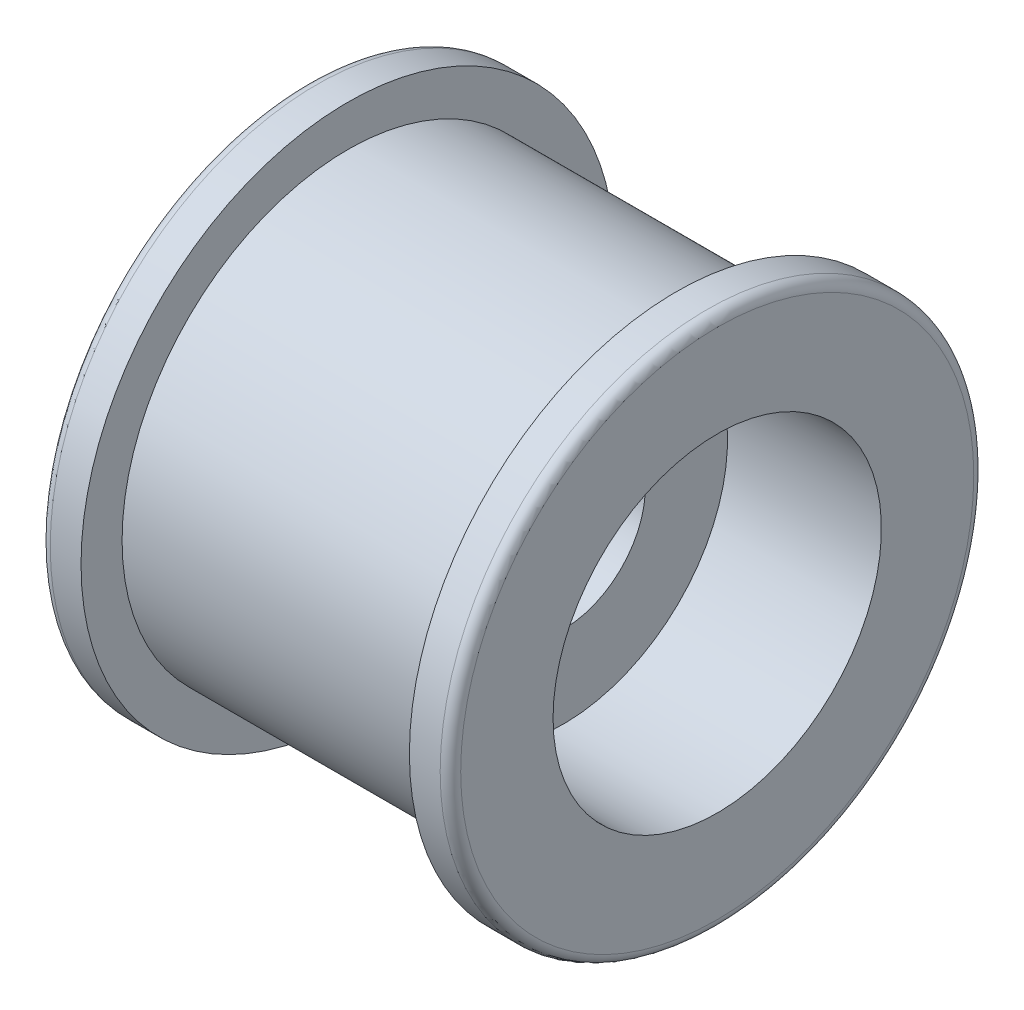
ISO-10303-21;
HEADER;
FILE_DESCRIPTION(('STEP AP214'),'2;1');
FILE_NAME('part.step','',(''),(''),'','','');
FILE_SCHEMA(('AUTOMOTIVE_DESIGN { 1 0 10303 214 1 1 1 1 }'));
ENDSEC;
DATA;
#1=APPLICATION_CONTEXT('core data for automotive mechanical design processes');
#2=APPLICATION_PROTOCOL_DEFINITION('international standard','automotive_design',2000,#1);
#3=PRODUCT_CONTEXT('',#1,'mechanical');
#4=PRODUCT('Part','Part','',(#3));
#5=PRODUCT_RELATED_PRODUCT_CATEGORY('part','',(#4));
#6=PRODUCT_DEFINITION_FORMATION('','',#4);
#7=PRODUCT_DEFINITION_CONTEXT('part definition',#1,'design');
#8=PRODUCT_DEFINITION('design','',#6,#7);
#9=PRODUCT_DEFINITION_SHAPE('','',#8);
#10=(LENGTH_UNIT() NAMED_UNIT(*) SI_UNIT(.MILLI.,.METRE.));
#11=(NAMED_UNIT(*) PLANE_ANGLE_UNIT() SI_UNIT($,.RADIAN.));
#12=(NAMED_UNIT(*) SI_UNIT($,.STERADIAN.) SOLID_ANGLE_UNIT());
#13=UNCERTAINTY_MEASURE_WITH_UNIT(LENGTH_MEASURE(1.E-05),#10,'distance_accuracy_value','');
#14=(GEOMETRIC_REPRESENTATION_CONTEXT(3) GLOBAL_UNCERTAINTY_ASSIGNED_CONTEXT((#13)) GLOBAL_UNIT_ASSIGNED_CONTEXT((#10,
#11,#12)) REPRESENTATION_CONTEXT('',''));
#15=CARTESIAN_POINT('',(0.,0.,0.));
#16=DIRECTION('',(0.,0.,1.));
#17=DIRECTION('',(1.,0.,0.));
#18=AXIS2_PLACEMENT_3D('',#15,#16,#17);
#19=CARTESIAN_POINT('',(17.9695550771957,6.99999999999999,0.));
#20=DIRECTION('',(1.,0.,0.));
#21=DIRECTION('',(0.,0.,-1.));
#22=AXIS2_PLACEMENT_3D('',#19,#20,#21);
#23=PLANE('',#22);
#24=CARTESIAN_POINT('',(17.9695550771957,-4.,0.));
#25=DIRECTION('',(-1.,0.,0.));
#26=DIRECTION('',(0.,0.,1.));
#27=AXIS2_PLACEMENT_3D('',#24,#25,#26);
#28=CIRCLE('',#27,11.);
#29=CARTESIAN_POINT('',(17.9695550771957,-4.,11.));
#30=VERTEX_POINT('',#29);
#31=EDGE_CURVE('E51',#30,#30,#28,.T.);
#32=ORIENTED_EDGE('',*,*,#31,.F.);
#33=EDGE_LOOP('',(#32));
#34=FACE_BOUND('',#33,.T.);
#35=CARTESIAN_POINT('',(17.9695550771957,-4.,0.));
#36=DIRECTION('',(-1.,0.,0.));
#37=DIRECTION('',(0.,0.,1.));
#38=AXIS2_PLACEMENT_3D('',#35,#36,#37);
#39=CIRCLE('',#38,13.);
#40=CARTESIAN_POINT('',(17.9695550771957,-4.,13.));
#41=VERTEX_POINT('',#40);
#42=EDGE_CURVE('E78',#41,#41,#39,.T.);
#43=ORIENTED_EDGE('',*,*,#42,.T.);
#44=EDGE_LOOP('',(#43));
#45=FACE_BOUND('',#44,.T.);
#46=ADVANCED_FACE('F31',(#34,#45),#23,.F.);
#47=CARTESIAN_POINT('',(-15.2512241435836,-4.,0.));
#48=DIRECTION('',(-1.,0.,0.));
#49=DIRECTION('',(0.,0.,1.));
#50=AXIS2_PLACEMENT_3D('',#47,#48,#49);
#51=CYLINDRICAL_SURFACE('',#50,11.);
#52=CARTESIAN_POINT('',(1.96955507719565,-4.,0.));
#53=DIRECTION('',(-1.,0.,0.));
#54=DIRECTION('',(0.,0.,1.));
#55=AXIS2_PLACEMENT_3D('',#52,#53,#54);
#56=CIRCLE('',#55,11.);
#57=CARTESIAN_POINT('',(1.96955507719565,-4.,11.));
#58=VERTEX_POINT('',#57);
#59=EDGE_CURVE('E54',#58,#58,#56,.T.);
#60=ORIENTED_EDGE('',*,*,#59,.F.);
#61=EDGE_LOOP('',(#60));
#62=FACE_BOUND('',#61,.T.);
#63=ORIENTED_EDGE('',*,*,#31,.T.);
#64=EDGE_LOOP('',(#63));
#65=FACE_BOUND('',#64,.T.);
#66=ADVANCED_FACE('F96',(#62,#65),#51,.T.);
#67=CARTESIAN_POINT('',(1.96955507719565,7.,0.));
#68=DIRECTION('',(-1.,0.,0.));
#69=DIRECTION('',(0.,0.,1.));
#70=AXIS2_PLACEMENT_3D('',#67,#68,#69);
#71=PLANE('',#70);
#72=CARTESIAN_POINT('',(1.96955507719565,-4.,0.));
#73=DIRECTION('',(-1.,0.,0.));
#74=DIRECTION('',(0.,0.,1.));
#75=AXIS2_PLACEMENT_3D('',#72,#73,#74);
#76=CIRCLE('',#75,13.);
#77=CARTESIAN_POINT('',(1.96955507719565,-4.,13.));
#78=VERTEX_POINT('',#77);
#79=EDGE_CURVE('E57',#78,#78,#76,.T.);
#80=ORIENTED_EDGE('',*,*,#79,.F.);
#81=EDGE_LOOP('',(#80));
#82=FACE_BOUND('',#81,.T.);
#83=ORIENTED_EDGE('',*,*,#59,.T.);
#84=EDGE_LOOP('',(#83));
#85=FACE_BOUND('',#84,.T.);
#86=ADVANCED_FACE('F102',(#82,#85),#71,.F.);
#87=CARTESIAN_POINT('',(-15.2512241435836,-4.,0.));
#88=DIRECTION('',(-1.,0.,0.));
#89=DIRECTION('',(0.,0.,1.));
#90=AXIS2_PLACEMENT_3D('',#87,#88,#89);
#91=CYLINDRICAL_SURFACE('',#90,13.);
#92=CARTESIAN_POINT('',(0.469555077195653,-4.,0.));
#93=DIRECTION('',(1.,0.,0.));
#94=DIRECTION('',(0.,0.,-1.));
#95=AXIS2_PLACEMENT_3D('',#92,#93,#94);
#96=CIRCLE('',#95,13.);
#97=CARTESIAN_POINT('',(0.469555077195653,-4.,-13.));
#98=VERTEX_POINT('',#97);
#99=EDGE_CURVE('E42',#98,#98,#96,.T.);
#100=ORIENTED_EDGE('',*,*,#99,.T.);
#101=EDGE_LOOP('',(#100));
#102=FACE_BOUND('',#101,.T.);
#103=ORIENTED_EDGE('',*,*,#79,.T.);
#104=EDGE_LOOP('',(#103));
#105=FACE_BOUND('',#104,.T.);
#106=ADVANCED_FACE('F109',(#102,#105),#91,.T.);
#107=CARTESIAN_POINT('',(-0.030444922804349,7.,0.));
#108=DIRECTION('',(1.,0.,0.));
#109=DIRECTION('',(0.,0.,-1.));
#110=AXIS2_PLACEMENT_3D('',#107,#108,#109);
#111=PLANE('',#110);
#112=CARTESIAN_POINT('',(-0.030444922804349,-4.,0.));
#113=DIRECTION('',(1.,0.,0.));
#114=DIRECTION('',(0.,0.,-1.));
#115=AXIS2_PLACEMENT_3D('',#112,#113,#114);
#116=CIRCLE('',#115,12.5);
#117=CARTESIAN_POINT('',(-0.030444922804349,-4.,-12.5));
#118=VERTEX_POINT('',#117);
#119=EDGE_CURVE('E46',#118,#118,#116,.F.);
#120=ORIENTED_EDGE('',*,*,#119,.T.);
#121=EDGE_LOOP('',(#120));
#122=FACE_BOUND('',#121,.T.);
#123=CARTESIAN_POINT('',(-0.0304449228043496,-4.,0.));
#124=DIRECTION('',(-1.,0.,0.));
#125=DIRECTION('',(0.,0.,1.));
#126=AXIS2_PLACEMENT_3D('',#123,#124,#125);
#127=CIRCLE('',#126,8.);
#128=CARTESIAN_POINT('',(-0.0304449228043496,-4.,8.));
#129=VERTEX_POINT('',#128);
#130=EDGE_CURVE('E60',#129,#129,#127,.T.);
#131=ORIENTED_EDGE('',*,*,#130,.F.);
#132=EDGE_LOOP('',(#131));
#133=FACE_BOUND('',#132,.T.);
#134=ADVANCED_FACE('F113',(#122,#133),#111,.F.);
#135=CARTESIAN_POINT('',(-15.2512241435836,-4.,0.));
#136=DIRECTION('',(-1.,0.,0.));
#137=DIRECTION('',(0.,0.,1.));
#138=AXIS2_PLACEMENT_3D('',#135,#136,#137);
#139=CYLINDRICAL_SURFACE('',#138,8.);
#140=CARTESIAN_POINT('',(7.46955507719565,-4.,0.));
#141=DIRECTION('',(-1.,0.,0.));
#142=DIRECTION('',(0.,0.,1.));
#143=AXIS2_PLACEMENT_3D('',#140,#141,#142);
#144=CIRCLE('',#143,8.);
#145=CARTESIAN_POINT('',(7.46955507719565,-4.,8.));
#146=VERTEX_POINT('',#145);
#147=EDGE_CURVE('E63',#146,#146,#144,.T.);
#148=ORIENTED_EDGE('',*,*,#147,.F.);
#149=EDGE_LOOP('',(#148));
#150=FACE_BOUND('',#149,.T.);
#151=ORIENTED_EDGE('',*,*,#130,.T.);
#152=EDGE_LOOP('',(#151));
#153=FACE_BOUND('',#152,.T.);
#154=ADVANCED_FACE('F117',(#150,#153),#139,.F.);
#155=CARTESIAN_POINT('',(7.46955507719565,4.,0.));
#156=DIRECTION('',(1.,0.,0.));
#157=DIRECTION('',(0.,0.,-1.));
#158=AXIS2_PLACEMENT_3D('',#155,#156,#157);
#159=PLANE('',#158);
#160=CARTESIAN_POINT('',(7.46955507719565,-4.,0.));
#161=DIRECTION('',(-1.,0.,0.));
#162=DIRECTION('',(0.,0.,1.));
#163=AXIS2_PLACEMENT_3D('',#160,#161,#162);
#164=CIRCLE('',#163,4.);
#165=CARTESIAN_POINT('',(7.46955507719565,-4.,4.));
#166=VERTEX_POINT('',#165);
#167=EDGE_CURVE('E66',#166,#166,#164,.T.);
#168=ORIENTED_EDGE('',*,*,#167,.F.);
#169=EDGE_LOOP('',(#168));
#170=FACE_BOUND('',#169,.T.);
#171=ORIENTED_EDGE('',*,*,#147,.T.);
#172=EDGE_LOOP('',(#171));
#173=FACE_BOUND('',#172,.T.);
#174=ADVANCED_FACE('F121',(#170,#173),#159,.F.);
#175=CARTESIAN_POINT('',(-15.2512241435836,-4.,0.));
#176=DIRECTION('',(-1.,0.,0.));
#177=DIRECTION('',(0.,0.,1.));
#178=AXIS2_PLACEMENT_3D('',#175,#176,#177);
#179=CYLINDRICAL_SURFACE('',#178,4.);
#180=CARTESIAN_POINT('',(12.4695550771957,-4.,0.));
#181=DIRECTION('',(-1.,0.,0.));
#182=DIRECTION('',(0.,0.,1.));
#183=AXIS2_PLACEMENT_3D('',#180,#181,#182);
#184=CIRCLE('',#183,4.);
#185=CARTESIAN_POINT('',(12.4695550771957,-4.,4.));
#186=VERTEX_POINT('',#185);
#187=EDGE_CURVE('E69',#186,#186,#184,.T.);
#188=ORIENTED_EDGE('',*,*,#187,.F.);
#189=EDGE_LOOP('',(#188));
#190=FACE_BOUND('',#189,.T.);
#191=ORIENTED_EDGE('',*,*,#167,.T.);
#192=EDGE_LOOP('',(#191));
#193=FACE_BOUND('',#192,.T.);
#194=ADVANCED_FACE('F125',(#190,#193),#179,.F.);
#195=CARTESIAN_POINT('',(12.4695550771957,0.,0.));
#196=DIRECTION('',(-1.,0.,0.));
#197=DIRECTION('',(0.,0.,1.));
#198=AXIS2_PLACEMENT_3D('',#195,#196,#197);
#199=PLANE('',#198);
#200=CARTESIAN_POINT('',(12.4695550771957,-4.,0.));
#201=DIRECTION('',(-1.,0.,0.));
#202=DIRECTION('',(0.,0.,1.));
#203=AXIS2_PLACEMENT_3D('',#200,#201,#202);
#204=CIRCLE('',#203,8.);
#205=CARTESIAN_POINT('',(12.4695550771957,-4.,8.));
#206=VERTEX_POINT('',#205);
#207=EDGE_CURVE('E72',#206,#206,#204,.T.);
#208=ORIENTED_EDGE('',*,*,#207,.F.);
#209=EDGE_LOOP('',(#208));
#210=FACE_BOUND('',#209,.T.);
#211=ORIENTED_EDGE('',*,*,#187,.T.);
#212=EDGE_LOOP('',(#211));
#213=FACE_BOUND('',#212,.T.);
#214=ADVANCED_FACE('F129',(#210,#213),#199,.F.);
#215=CARTESIAN_POINT('',(-15.2512241435836,-4.,0.));
#216=DIRECTION('',(-1.,0.,0.));
#217=DIRECTION('',(0.,0.,1.));
#218=AXIS2_PLACEMENT_3D('',#215,#216,#217);
#219=CYLINDRICAL_SURFACE('',#218,8.);
#220=CARTESIAN_POINT('',(19.9695550771957,-4.,0.));
#221=DIRECTION('',(-1.,0.,0.));
#222=DIRECTION('',(0.,0.,1.));
#223=AXIS2_PLACEMENT_3D('',#220,#221,#222);
#224=CIRCLE('',#223,8.);
#225=CARTESIAN_POINT('',(19.9695550771957,-4.,8.));
#226=VERTEX_POINT('',#225);
#227=EDGE_CURVE('E75',#226,#226,#224,.T.);
#228=ORIENTED_EDGE('',*,*,#227,.F.);
#229=EDGE_LOOP('',(#228));
#230=FACE_BOUND('',#229,.T.);
#231=ORIENTED_EDGE('',*,*,#207,.T.);
#232=EDGE_LOOP('',(#231));
#233=FACE_BOUND('',#232,.T.);
#234=ADVANCED_FACE('F93',(#230,#233),#219,.F.);
#235=CARTESIAN_POINT('',(19.9695550771957,7.,0.));
#236=DIRECTION('',(-1.,0.,0.));
#237=DIRECTION('',(0.,0.,1.));
#238=AXIS2_PLACEMENT_3D('',#235,#236,#237);
#239=PLANE('',#238);
#240=CARTESIAN_POINT('',(19.9695550771957,-4.,0.));
#241=DIRECTION('',(-1.,0.,0.));
#242=DIRECTION('',(0.,0.,1.));
#243=AXIS2_PLACEMENT_3D('',#240,#241,#242);
#244=CIRCLE('',#243,12.5);
#245=CARTESIAN_POINT('',(19.9695550771957,-4.,12.5));
#246=VERTEX_POINT('',#245);
#247=EDGE_CURVE('E10',#246,#246,#244,.F.);
#248=ORIENTED_EDGE('',*,*,#247,.T.);
#249=EDGE_LOOP('',(#248));
#250=FACE_BOUND('',#249,.T.);
#251=ORIENTED_EDGE('',*,*,#227,.T.);
#252=EDGE_LOOP('',(#251));
#253=FACE_BOUND('',#252,.T.);
#254=ADVANCED_FACE('F86',(#250,#253),#239,.F.);
#255=CARTESIAN_POINT('',(-15.2512241435836,-4.,0.));
#256=DIRECTION('',(-1.,0.,0.));
#257=DIRECTION('',(0.,0.,1.));
#258=AXIS2_PLACEMENT_3D('',#255,#256,#257);
#259=CYLINDRICAL_SURFACE('',#258,13.);
#260=CARTESIAN_POINT('',(19.4695550771957,-4.,0.));
#261=DIRECTION('',(-1.,0.,0.));
#262=DIRECTION('',(0.,0.,1.));
#263=AXIS2_PLACEMENT_3D('',#260,#261,#262);
#264=CIRCLE('',#263,13.);
#265=CARTESIAN_POINT('',(19.4695550771957,-4.,13.));
#266=VERTEX_POINT('',#265);
#267=EDGE_CURVE('E38',#266,#266,#264,.T.);
#268=ORIENTED_EDGE('',*,*,#267,.T.);
#269=EDGE_LOOP('',(#268));
#270=FACE_BOUND('',#269,.T.);
#271=ORIENTED_EDGE('',*,*,#42,.F.);
#272=EDGE_LOOP('',(#271));
#273=FACE_BOUND('',#272,.T.);
#274=ADVANCED_FACE('F83',(#270,#273),#259,.T.);
#275=CARTESIAN_POINT('',(0.469555077195653,-4.,0.));
#276=DIRECTION('',(1.,0.,0.));
#277=DIRECTION('',(0.,0.,-1.));
#278=AXIS2_PLACEMENT_3D('',#275,#276,#277);
#279=TOROIDAL_SURFACE('',#278,12.5,0.5);
#280=ORIENTED_EDGE('',*,*,#99,.F.);
#281=EDGE_LOOP('',(#280));
#282=FACE_BOUND('',#281,.T.);
#283=ORIENTED_EDGE('',*,*,#119,.F.);
#284=EDGE_LOOP('',(#283));
#285=FACE_BOUND('',#284,.T.);
#286=ADVANCED_FACE('F85',(#282,#285),#279,.T.);
#287=CARTESIAN_POINT('',(19.4695550771957,-4.,0.));
#288=DIRECTION('',(-1.,0.,0.));
#289=DIRECTION('',(0.,0.,1.));
#290=AXIS2_PLACEMENT_3D('',#287,#288,#289);
#291=TOROIDAL_SURFACE('',#290,12.5,0.5);
#292=ORIENTED_EDGE('',*,*,#247,.F.);
#293=EDGE_LOOP('',(#292));
#294=FACE_BOUND('',#293,.T.);
#295=ORIENTED_EDGE('',*,*,#267,.F.);
#296=EDGE_LOOP('',(#295));
#297=FACE_BOUND('',#296,.T.);
#298=ADVANCED_FACE('F33',(#294,#297),#291,.T.);
#299=CLOSED_SHELL('',(#46,#66,#86,#106,#134,#154,#174,#194,#214,#234,#254,#274,#286,#298));
#300=MANIFOLD_SOLID_BREP('B2',#299);
#301=ADVANCED_BREP_SHAPE_REPRESENTATION('',(#18,#300),#14);
#302=SHAPE_DEFINITION_REPRESENTATION(#9,#301);
ENDSEC;
END-ISO-10303-21;
